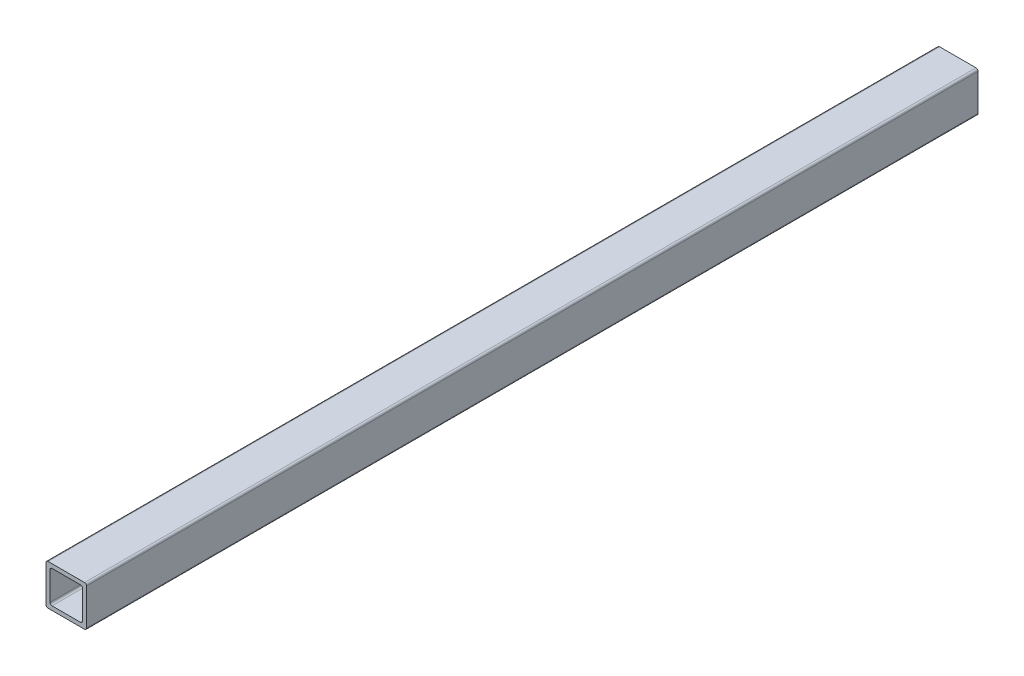
ISO-10303-21;
HEADER;
FILE_DESCRIPTION(('STEP AP214'),'2;1');
FILE_NAME('part.step','',(''),(''),'','','');
FILE_SCHEMA(('AUTOMOTIVE_DESIGN { 1 0 10303 214 1 1 1 1 }'));
ENDSEC;
DATA;
#1=APPLICATION_CONTEXT('core data for automotive mechanical design processes');
#2=APPLICATION_PROTOCOL_DEFINITION('international standard','automotive_design',2000,#1);
#3=PRODUCT_CONTEXT('',#1,'mechanical');
#4=PRODUCT('Part','Part','',(#3));
#5=PRODUCT_RELATED_PRODUCT_CATEGORY('part','',(#4));
#6=PRODUCT_DEFINITION_FORMATION('','',#4);
#7=PRODUCT_DEFINITION_CONTEXT('part definition',#1,'design');
#8=PRODUCT_DEFINITION('design','',#6,#7);
#9=PRODUCT_DEFINITION_SHAPE('','',#8);
#10=(LENGTH_UNIT() NAMED_UNIT(*) SI_UNIT(.MILLI.,.METRE.));
#11=(NAMED_UNIT(*) PLANE_ANGLE_UNIT() SI_UNIT($,.RADIAN.));
#12=(NAMED_UNIT(*) SI_UNIT($,.STERADIAN.) SOLID_ANGLE_UNIT());
#13=UNCERTAINTY_MEASURE_WITH_UNIT(LENGTH_MEASURE(1.E-05),#10,'distance_accuracy_value','');
#14=(GEOMETRIC_REPRESENTATION_CONTEXT(3) GLOBAL_UNCERTAINTY_ASSIGNED_CONTEXT((#13)) GLOBAL_UNIT_ASSIGNED_CONTEXT((#10,
#11,#12)) REPRESENTATION_CONTEXT('',''));
#15=CARTESIAN_POINT('',(0.,0.,0.));
#16=DIRECTION('',(0.,0.,1.));
#17=DIRECTION('',(1.,0.,0.));
#18=AXIS2_PLACEMENT_3D('',#15,#16,#17);
#19=CARTESIAN_POINT('',(2.,2.,880.));
#20=DIRECTION('',(0.,0.,-1.));
#21=DIRECTION('',(-1.,0.,0.));
#22=AXIS2_PLACEMENT_3D('',#19,#20,#21);
#23=PLANE('',#22);
#24=CARTESIAN_POINT('',(2.,2.,880.));
#25=DIRECTION('',(0.,0.,1.));
#26=DIRECTION('',(-1.,0.,0.));
#27=AXIS2_PLACEMENT_3D('',#24,#25,#26);
#28=CIRCLE('',#27,2.);
#29=CARTESIAN_POINT('',(0.,2.00000000000001,880.));
#30=VERTEX_POINT('',#29);
#31=CARTESIAN_POINT('',(2.00000000000001,0.,880.));
#32=VERTEX_POINT('',#31);
#33=EDGE_CURVE('E210',#30,#32,#28,.T.);
#34=ORIENTED_EDGE('',*,*,#33,.T.);
#35=DIRECTION('',(1.,0.,0.));
#36=VECTOR('',#35,1.);
#37=CARTESIAN_POINT('',(2.00000000000001,0.,880.));
#38=LINE('',#37,#36);
#39=CARTESIAN_POINT('',(38.,0.,880.));
#40=VERTEX_POINT('',#39);
#41=EDGE_CURVE('E213',#32,#40,#38,.T.);
#42=ORIENTED_EDGE('',*,*,#41,.T.);
#43=CARTESIAN_POINT('',(38.,2.,880.));
#44=DIRECTION('',(0.,0.,1.));
#45=DIRECTION('',(-1.,0.,0.));
#46=AXIS2_PLACEMENT_3D('',#43,#44,#45);
#47=CIRCLE('',#46,2.);
#48=CARTESIAN_POINT('',(40.,2.00000000000001,880.));
#49=VERTEX_POINT('',#48);
#50=EDGE_CURVE('E216',#40,#49,#47,.T.);
#51=ORIENTED_EDGE('',*,*,#50,.T.);
#52=DIRECTION('',(0.,1.,0.));
#53=VECTOR('',#52,1.);
#54=CARTESIAN_POINT('',(40.,2.00000000000001,880.));
#55=LINE('',#54,#53);
#56=CARTESIAN_POINT('',(40.,38.,880.));
#57=VERTEX_POINT('',#56);
#58=EDGE_CURVE('E218',#49,#57,#55,.T.);
#59=ORIENTED_EDGE('',*,*,#58,.T.);
#60=CARTESIAN_POINT('',(38.,38.,880.));
#61=DIRECTION('',(0.,0.,1.));
#62=DIRECTION('',(-1.,0.,0.));
#63=AXIS2_PLACEMENT_3D('',#60,#61,#62);
#64=CIRCLE('',#63,2.);
#65=CARTESIAN_POINT('',(38.,40.,880.));
#66=VERTEX_POINT('',#65);
#67=EDGE_CURVE('E220',#57,#66,#64,.T.);
#68=ORIENTED_EDGE('',*,*,#67,.T.);
#69=DIRECTION('',(-1.,0.,0.));
#70=VECTOR('',#69,1.);
#71=CARTESIAN_POINT('',(2.00000000000001,40.,880.));
#72=LINE('',#71,#70);
#73=CARTESIAN_POINT('',(2.00000000000001,40.,880.));
#74=VERTEX_POINT('',#73);
#75=EDGE_CURVE('E222',#66,#74,#72,.T.);
#76=ORIENTED_EDGE('',*,*,#75,.T.);
#77=CARTESIAN_POINT('',(2.,38.,880.));
#78=DIRECTION('',(0.,0.,1.));
#79=DIRECTION('',(-1.,0.,0.));
#80=AXIS2_PLACEMENT_3D('',#77,#78,#79);
#81=CIRCLE('',#80,2.);
#82=CARTESIAN_POINT('',(0.,38.,880.));
#83=VERTEX_POINT('',#82);
#84=EDGE_CURVE('E224',#74,#83,#81,.T.);
#85=ORIENTED_EDGE('',*,*,#84,.T.);
#86=DIRECTION('',(0.,-1.,0.));
#87=VECTOR('',#86,1.);
#88=CARTESIAN_POINT('',(0.,2.00000000000001,880.));
#89=LINE('',#88,#87);
#90=EDGE_CURVE('E226',#83,#30,#89,.T.);
#91=ORIENTED_EDGE('',*,*,#90,.T.);
#92=EDGE_LOOP('',(#34,#42,#51,#59,#68,#76,#85,#91));
#93=FACE_BOUND('',#92,.T.);
#94=CARTESIAN_POINT('',(34.,6.,880.));
#95=DIRECTION('',(0.,0.,1.));
#96=DIRECTION('',(1.,0.,0.));
#97=AXIS2_PLACEMENT_3D('',#94,#95,#96);
#98=CIRCLE('',#97,2.);
#99=CARTESIAN_POINT('',(34.,4.,880.));
#100=VERTEX_POINT('',#99);
#101=CARTESIAN_POINT('',(36.,6.00000000000001,880.));
#102=VERTEX_POINT('',#101);
#103=EDGE_CURVE('E145',#100,#102,#98,.T.);
#104=ORIENTED_EDGE('',*,*,#103,.F.);
#105=DIRECTION('',(1.,0.,0.));
#106=VECTOR('',#105,1.);
#107=CARTESIAN_POINT('',(6.00000000000001,4.,880.));
#108=LINE('',#107,#106);
#109=CARTESIAN_POINT('',(6.00000000000001,4.,880.));
#110=VERTEX_POINT('',#109);
#111=EDGE_CURVE('E178',#110,#100,#108,.T.);
#112=ORIENTED_EDGE('',*,*,#111,.F.);
#113=CARTESIAN_POINT('',(6.,6.,880.));
#114=DIRECTION('',(0.,0.,1.));
#115=DIRECTION('',(1.,0.,0.));
#116=AXIS2_PLACEMENT_3D('',#113,#114,#115);
#117=CIRCLE('',#116,2.);
#118=CARTESIAN_POINT('',(4.,6.00000000000001,880.));
#119=VERTEX_POINT('',#118);
#120=EDGE_CURVE('E176',#119,#110,#117,.T.);
#121=ORIENTED_EDGE('',*,*,#120,.F.);
#122=DIRECTION('',(0.,-1.,0.));
#123=VECTOR('',#122,1.);
#124=CARTESIAN_POINT('',(4.,6.00000000000001,880.));
#125=LINE('',#124,#123);
#126=CARTESIAN_POINT('',(4.,34.,880.));
#127=VERTEX_POINT('',#126);
#128=EDGE_CURVE('E174',#127,#119,#125,.T.);
#129=ORIENTED_EDGE('',*,*,#128,.F.);
#130=CARTESIAN_POINT('',(6.,34.,880.));
#131=DIRECTION('',(0.,0.,1.));
#132=DIRECTION('',(1.,0.,0.));
#133=AXIS2_PLACEMENT_3D('',#130,#131,#132);
#134=CIRCLE('',#133,2.);
#135=CARTESIAN_POINT('',(6.00000000000001,36.,880.));
#136=VERTEX_POINT('',#135);
#137=EDGE_CURVE('E172',#136,#127,#134,.T.);
#138=ORIENTED_EDGE('',*,*,#137,.F.);
#139=DIRECTION('',(-1.,0.,0.));
#140=VECTOR('',#139,1.);
#141=CARTESIAN_POINT('',(6.00000000000001,36.,880.));
#142=LINE('',#141,#140);
#143=CARTESIAN_POINT('',(34.,36.,880.));
#144=VERTEX_POINT('',#143);
#145=EDGE_CURVE('E168',#144,#136,#142,.T.);
#146=ORIENTED_EDGE('',*,*,#145,.F.);
#147=CARTESIAN_POINT('',(34.,34.,880.));
#148=DIRECTION('',(0.,0.,1.));
#149=DIRECTION('',(1.,0.,0.));
#150=AXIS2_PLACEMENT_3D('',#147,#148,#149);
#151=CIRCLE('',#150,2.);
#152=CARTESIAN_POINT('',(36.,34.,880.));
#153=VERTEX_POINT('',#152);
#154=EDGE_CURVE('E166',#153,#144,#151,.T.);
#155=ORIENTED_EDGE('',*,*,#154,.F.);
#156=DIRECTION('',(0.,1.,0.));
#157=VECTOR('',#156,1.);
#158=CARTESIAN_POINT('',(36.,6.00000000000001,880.));
#159=LINE('',#158,#157);
#160=EDGE_CURVE('E153',#102,#153,#159,.T.);
#161=ORIENTED_EDGE('',*,*,#160,.F.);
#162=EDGE_LOOP('',(#104,#112,#121,#129,#138,#146,#155,#161));
#163=FACE_BOUND('',#162,.T.);
#164=ADVANCED_FACE('F32',(#93,#163),#23,.F.);
#165=CARTESIAN_POINT('',(2.,2.,0.));
#166=DIRECTION('',(0.,0.,-1.));
#167=DIRECTION('',(-1.,0.,0.));
#168=AXIS2_PLACEMENT_3D('',#165,#166,#167);
#169=PLANE('',#168);
#170=CARTESIAN_POINT('',(2.,2.,0.));
#171=DIRECTION('',(0.,0.,1.));
#172=DIRECTION('',(-1.,0.,0.));
#173=AXIS2_PLACEMENT_3D('',#170,#171,#172);
#174=CIRCLE('',#173,2.);
#175=CARTESIAN_POINT('',(0.,2.00000000000001,0.));
#176=VERTEX_POINT('',#175);
#177=CARTESIAN_POINT('',(2.00000000000001,0.,0.));
#178=VERTEX_POINT('',#177);
#179=EDGE_CURVE('E161',#176,#178,#174,.T.);
#180=ORIENTED_EDGE('',*,*,#179,.F.);
#181=DIRECTION('',(0.,-1.,0.));
#182=VECTOR('',#181,1.);
#183=CARTESIAN_POINT('',(0.,2.00000000000001,0.));
#184=LINE('',#183,#182);
#185=CARTESIAN_POINT('',(0.,38.,0.));
#186=VERTEX_POINT('',#185);
#187=EDGE_CURVE('E214',#186,#176,#184,.T.);
#188=ORIENTED_EDGE('',*,*,#187,.F.);
#189=CARTESIAN_POINT('',(2.,38.,0.));
#190=DIRECTION('',(0.,0.,1.));
#191=DIRECTION('',(-1.,0.,0.));
#192=AXIS2_PLACEMENT_3D('',#189,#190,#191);
#193=CIRCLE('',#192,2.);
#194=CARTESIAN_POINT('',(2.00000000000001,40.,0.));
#195=VERTEX_POINT('',#194);
#196=EDGE_CURVE('E241',#195,#186,#193,.T.);
#197=ORIENTED_EDGE('',*,*,#196,.F.);
#198=DIRECTION('',(-1.,0.,0.));
#199=VECTOR('',#198,1.);
#200=CARTESIAN_POINT('',(2.00000000000001,40.,0.));
#201=LINE('',#200,#199);
#202=CARTESIAN_POINT('',(38.,40.,0.));
#203=VERTEX_POINT('',#202);
#204=EDGE_CURVE('E239',#203,#195,#201,.T.);
#205=ORIENTED_EDGE('',*,*,#204,.F.);
#206=CARTESIAN_POINT('',(38.,38.,0.));
#207=DIRECTION('',(0.,0.,1.));
#208=DIRECTION('',(-1.,0.,0.));
#209=AXIS2_PLACEMENT_3D('',#206,#207,#208);
#210=CIRCLE('',#209,2.);
#211=CARTESIAN_POINT('',(40.,38.,0.));
#212=VERTEX_POINT('',#211);
#213=EDGE_CURVE('E237',#212,#203,#210,.T.);
#214=ORIENTED_EDGE('',*,*,#213,.F.);
#215=DIRECTION('',(0.,1.,0.));
#216=VECTOR('',#215,1.);
#217=CARTESIAN_POINT('',(40.,2.00000000000001,0.));
#218=LINE('',#217,#216);
#219=CARTESIAN_POINT('',(40.,2.00000000000001,0.));
#220=VERTEX_POINT('',#219);
#221=EDGE_CURVE('E235',#220,#212,#218,.T.);
#222=ORIENTED_EDGE('',*,*,#221,.F.);
#223=CARTESIAN_POINT('',(38.,2.,0.));
#224=DIRECTION('',(0.,0.,1.));
#225=DIRECTION('',(-1.,0.,0.));
#226=AXIS2_PLACEMENT_3D('',#223,#224,#225);
#227=CIRCLE('',#226,2.);
#228=CARTESIAN_POINT('',(38.,0.,0.));
#229=VERTEX_POINT('',#228);
#230=EDGE_CURVE('E233',#229,#220,#227,.T.);
#231=ORIENTED_EDGE('',*,*,#230,.F.);
#232=DIRECTION('',(1.,0.,0.));
#233=VECTOR('',#232,1.);
#234=CARTESIAN_POINT('',(2.00000000000001,0.,0.));
#235=LINE('',#234,#233);
#236=EDGE_CURVE('E231',#178,#229,#235,.T.);
#237=ORIENTED_EDGE('',*,*,#236,.F.);
#238=EDGE_LOOP('',(#180,#188,#197,#205,#214,#222,#231,#237));
#239=FACE_BOUND('',#238,.T.);
#240=DIRECTION('',(1.,0.,0.));
#241=VECTOR('',#240,1.);
#242=CARTESIAN_POINT('',(6.00000000000001,4.,0.));
#243=LINE('',#242,#241);
#244=CARTESIAN_POINT('',(6.00000000000001,4.,0.));
#245=VERTEX_POINT('',#244);
#246=CARTESIAN_POINT('',(34.,4.,0.));
#247=VERTEX_POINT('',#246);
#248=EDGE_CURVE('E154',#245,#247,#243,.T.);
#249=ORIENTED_EDGE('',*,*,#248,.T.);
#250=CARTESIAN_POINT('',(34.,6.,0.));
#251=DIRECTION('',(0.,0.,1.));
#252=DIRECTION('',(1.,0.,0.));
#253=AXIS2_PLACEMENT_3D('',#250,#251,#252);
#254=CIRCLE('',#253,2.);
#255=CARTESIAN_POINT('',(36.,6.00000000000001,0.));
#256=VERTEX_POINT('',#255);
#257=EDGE_CURVE('E55',#247,#256,#254,.T.);
#258=ORIENTED_EDGE('',*,*,#257,.T.);
#259=DIRECTION('',(0.,1.,0.));
#260=VECTOR('',#259,1.);
#261=CARTESIAN_POINT('',(36.,6.00000000000001,0.));
#262=LINE('',#261,#260);
#263=CARTESIAN_POINT('',(36.,34.,0.));
#264=VERTEX_POINT('',#263);
#265=EDGE_CURVE('E160',#256,#264,#262,.T.);
#266=ORIENTED_EDGE('',*,*,#265,.T.);
#267=CARTESIAN_POINT('',(34.,34.,0.));
#268=DIRECTION('',(0.,0.,1.));
#269=DIRECTION('',(1.,0.,0.));
#270=AXIS2_PLACEMENT_3D('',#267,#268,#269);
#271=CIRCLE('',#270,2.);
#272=CARTESIAN_POINT('',(34.,36.,0.));
#273=VERTEX_POINT('',#272);
#274=EDGE_CURVE('E182',#264,#273,#271,.T.);
#275=ORIENTED_EDGE('',*,*,#274,.T.);
#276=DIRECTION('',(-1.,0.,0.));
#277=VECTOR('',#276,1.);
#278=CARTESIAN_POINT('',(6.00000000000001,36.,0.));
#279=LINE('',#278,#277);
#280=CARTESIAN_POINT('',(6.00000000000001,36.,0.));
#281=VERTEX_POINT('',#280);
#282=EDGE_CURVE('E185',#273,#281,#279,.T.);
#283=ORIENTED_EDGE('',*,*,#282,.T.);
#284=CARTESIAN_POINT('',(6.,34.,0.));
#285=DIRECTION('',(0.,0.,1.));
#286=DIRECTION('',(1.,0.,0.));
#287=AXIS2_PLACEMENT_3D('',#284,#285,#286);
#288=CIRCLE('',#287,2.);
#289=CARTESIAN_POINT('',(4.,34.,0.));
#290=VERTEX_POINT('',#289);
#291=EDGE_CURVE('E188',#281,#290,#288,.T.);
#292=ORIENTED_EDGE('',*,*,#291,.T.);
#293=DIRECTION('',(0.,-1.,0.));
#294=VECTOR('',#293,1.);
#295=CARTESIAN_POINT('',(4.,6.00000000000001,0.));
#296=LINE('',#295,#294);
#297=CARTESIAN_POINT('',(4.,6.00000000000001,0.));
#298=VERTEX_POINT('',#297);
#299=EDGE_CURVE('E191',#290,#298,#296,.T.);
#300=ORIENTED_EDGE('',*,*,#299,.T.);
#301=CARTESIAN_POINT('',(6.,6.,0.));
#302=DIRECTION('',(0.,0.,1.));
#303=DIRECTION('',(1.,0.,0.));
#304=AXIS2_PLACEMENT_3D('',#301,#302,#303);
#305=CIRCLE('',#304,2.);
#306=EDGE_CURVE('E194',#298,#245,#305,.T.);
#307=ORIENTED_EDGE('',*,*,#306,.T.);
#308=EDGE_LOOP('',(#249,#258,#266,#275,#283,#292,#300,#307));
#309=FACE_BOUND('',#308,.T.);
#310=ADVANCED_FACE('F271',(#239,#309),#169,.T.);
#311=CARTESIAN_POINT('',(2.,2.,880.));
#312=DIRECTION('',(0.,0.,-1.));
#313=DIRECTION('',(-1.,0.,0.));
#314=AXIS2_PLACEMENT_3D('',#311,#312,#313);
#315=CYLINDRICAL_SURFACE('',#314,2.);
#316=ORIENTED_EDGE('',*,*,#179,.T.);
#317=DIRECTION('',(0.,0.,-1.));
#318=VECTOR('',#317,1.);
#319=CARTESIAN_POINT('',(2.00000000000001,0.,880.));
#320=LINE('',#319,#318);
#321=EDGE_CURVE('E11',#32,#178,#320,.T.);
#322=ORIENTED_EDGE('',*,*,#321,.F.);
#323=ORIENTED_EDGE('',*,*,#33,.F.);
#324=DIRECTION('',(0.,0.,-1.));
#325=VECTOR('',#324,1.);
#326=CARTESIAN_POINT('',(0.,2.00000000000001,880.));
#327=LINE('',#326,#325);
#328=EDGE_CURVE('E228',#30,#176,#327,.T.);
#329=ORIENTED_EDGE('',*,*,#328,.T.);
#330=EDGE_LOOP('',(#316,#322,#323,#329));
#331=FACE_BOUND('',#330,.T.);
#332=ADVANCED_FACE('F34',(#331),#315,.T.);
#333=CARTESIAN_POINT('',(2.00000000000001,0.,880.));
#334=DIRECTION('',(0.,1.,0.));
#335=DIRECTION('',(0.,0.,1.));
#336=AXIS2_PLACEMENT_3D('',#333,#334,#335);
#337=PLANE('',#336);
#338=ORIENTED_EDGE('',*,*,#236,.T.);
#339=DIRECTION('',(0.,0.,-1.));
#340=VECTOR('',#339,1.);
#341=CARTESIAN_POINT('',(38.,0.,880.));
#342=LINE('',#341,#340);
#343=EDGE_CURVE('E40',#40,#229,#342,.T.);
#344=ORIENTED_EDGE('',*,*,#343,.F.);
#345=ORIENTED_EDGE('',*,*,#41,.F.);
#346=ORIENTED_EDGE('',*,*,#321,.T.);
#347=EDGE_LOOP('',(#338,#344,#345,#346));
#348=FACE_BOUND('',#347,.T.);
#349=ADVANCED_FACE('F288',(#348),#337,.F.);
#350=CARTESIAN_POINT('',(38.,2.,880.));
#351=DIRECTION('',(0.,0.,-1.));
#352=DIRECTION('',(-1.,0.,0.));
#353=AXIS2_PLACEMENT_3D('',#350,#351,#352);
#354=CYLINDRICAL_SURFACE('',#353,2.);
#355=ORIENTED_EDGE('',*,*,#230,.T.);
#356=DIRECTION('',(0.,0.,-1.));
#357=VECTOR('',#356,1.);
#358=CARTESIAN_POINT('',(40.,2.00000000000001,880.));
#359=LINE('',#358,#357);
#360=EDGE_CURVE('E258',#49,#220,#359,.T.);
#361=ORIENTED_EDGE('',*,*,#360,.F.);
#362=ORIENTED_EDGE('',*,*,#50,.F.);
#363=ORIENTED_EDGE('',*,*,#343,.T.);
#364=EDGE_LOOP('',(#355,#361,#362,#363));
#365=FACE_BOUND('',#364,.T.);
#366=ADVANCED_FACE('F265',(#365),#354,.T.);
#367=CARTESIAN_POINT('',(40.,2.00000000000001,880.));
#368=DIRECTION('',(-1.,0.,0.));
#369=DIRECTION('',(0.,0.,1.));
#370=AXIS2_PLACEMENT_3D('',#367,#368,#369);
#371=PLANE('',#370);
#372=ORIENTED_EDGE('',*,*,#221,.T.);
#373=DIRECTION('',(0.,0.,-1.));
#374=VECTOR('',#373,1.);
#375=CARTESIAN_POINT('',(40.,38.,880.));
#376=LINE('',#375,#374);
#377=EDGE_CURVE('E255',#57,#212,#376,.T.);
#378=ORIENTED_EDGE('',*,*,#377,.F.);
#379=ORIENTED_EDGE('',*,*,#58,.F.);
#380=ORIENTED_EDGE('',*,*,#360,.T.);
#381=EDGE_LOOP('',(#372,#378,#379,#380));
#382=FACE_BOUND('',#381,.T.);
#383=ADVANCED_FACE('F277',(#382),#371,.F.);
#384=CARTESIAN_POINT('',(38.,38.,880.));
#385=DIRECTION('',(0.,0.,-1.));
#386=DIRECTION('',(-1.,0.,0.));
#387=AXIS2_PLACEMENT_3D('',#384,#385,#386);
#388=CYLINDRICAL_SURFACE('',#387,2.);
#389=ORIENTED_EDGE('',*,*,#213,.T.);
#390=DIRECTION('',(0.,0.,-1.));
#391=VECTOR('',#390,1.);
#392=CARTESIAN_POINT('',(38.,40.,880.));
#393=LINE('',#392,#391);
#394=EDGE_CURVE('E252',#66,#203,#393,.T.);
#395=ORIENTED_EDGE('',*,*,#394,.F.);
#396=ORIENTED_EDGE('',*,*,#67,.F.);
#397=ORIENTED_EDGE('',*,*,#377,.T.);
#398=EDGE_LOOP('',(#389,#395,#396,#397));
#399=FACE_BOUND('',#398,.T.);
#400=ADVANCED_FACE('F281',(#399),#388,.T.);
#401=CARTESIAN_POINT('',(2.00000000000001,40.,880.));
#402=DIRECTION('',(0.,-1.,0.));
#403=DIRECTION('',(0.,0.,-1.));
#404=AXIS2_PLACEMENT_3D('',#401,#402,#403);
#405=PLANE('',#404);
#406=ORIENTED_EDGE('',*,*,#204,.T.);
#407=DIRECTION('',(0.,0.,-1.));
#408=VECTOR('',#407,1.);
#409=CARTESIAN_POINT('',(2.00000000000001,40.,880.));
#410=LINE('',#409,#408);
#411=EDGE_CURVE('E249',#74,#195,#410,.T.);
#412=ORIENTED_EDGE('',*,*,#411,.F.);
#413=ORIENTED_EDGE('',*,*,#75,.F.);
#414=ORIENTED_EDGE('',*,*,#394,.T.);
#415=EDGE_LOOP('',(#406,#412,#413,#414));
#416=FACE_BOUND('',#415,.T.);
#417=ADVANCED_FACE('F301',(#416),#405,.F.);
#418=CARTESIAN_POINT('',(2.,38.,880.));
#419=DIRECTION('',(0.,0.,-1.));
#420=DIRECTION('',(-1.,0.,0.));
#421=AXIS2_PLACEMENT_3D('',#418,#419,#420);
#422=CYLINDRICAL_SURFACE('',#421,2.);
#423=ORIENTED_EDGE('',*,*,#196,.T.);
#424=DIRECTION('',(0.,0.,-1.));
#425=VECTOR('',#424,1.);
#426=CARTESIAN_POINT('',(0.,38.,880.));
#427=LINE('',#426,#425);
#428=EDGE_CURVE('E246',#83,#186,#427,.T.);
#429=ORIENTED_EDGE('',*,*,#428,.F.);
#430=ORIENTED_EDGE('',*,*,#84,.F.);
#431=ORIENTED_EDGE('',*,*,#411,.T.);
#432=EDGE_LOOP('',(#423,#429,#430,#431));
#433=FACE_BOUND('',#432,.T.);
#434=ADVANCED_FACE('F299',(#433),#422,.T.);
#435=CARTESIAN_POINT('',(0.,2.00000000000001,880.));
#436=DIRECTION('',(1.,0.,0.));
#437=DIRECTION('',(0.,0.,-1.));
#438=AXIS2_PLACEMENT_3D('',#435,#436,#437);
#439=PLANE('',#438);
#440=ORIENTED_EDGE('',*,*,#187,.T.);
#441=ORIENTED_EDGE('',*,*,#328,.F.);
#442=ORIENTED_EDGE('',*,*,#90,.F.);
#443=ORIENTED_EDGE('',*,*,#428,.T.);
#444=EDGE_LOOP('',(#440,#441,#442,#443));
#445=FACE_BOUND('',#444,.T.);
#446=ADVANCED_FACE('F294',(#445),#439,.F.);
#447=CARTESIAN_POINT('',(34.,6.,880.));
#448=DIRECTION('',(0.,0.,-1.));
#449=DIRECTION('',(-1.,0.,0.));
#450=AXIS2_PLACEMENT_3D('',#447,#448,#449);
#451=CYLINDRICAL_SURFACE('',#450,2.);
#452=ORIENTED_EDGE('',*,*,#257,.F.);
#453=DIRECTION('',(0.,0.,-1.));
#454=VECTOR('',#453,1.);
#455=CARTESIAN_POINT('',(34.,4.,880.));
#456=LINE('',#455,#454);
#457=EDGE_CURVE('E149',#100,#247,#456,.T.);
#458=ORIENTED_EDGE('',*,*,#457,.F.);
#459=ORIENTED_EDGE('',*,*,#103,.T.);
#460=DIRECTION('',(0.,0.,-1.));
#461=VECTOR('',#460,1.);
#462=CARTESIAN_POINT('',(36.,6.00000000000001,880.));
#463=LINE('',#462,#461);
#464=EDGE_CURVE('E148',#102,#256,#463,.T.);
#465=ORIENTED_EDGE('',*,*,#464,.T.);
#466=EDGE_LOOP('',(#452,#458,#459,#465));
#467=FACE_BOUND('',#466,.T.);
#468=ADVANCED_FACE('F147',(#467),#451,.F.);
#469=CARTESIAN_POINT('',(36.,6.00000000000001,880.));
#470=DIRECTION('',(-1.,0.,0.));
#471=DIRECTION('',(0.,0.,1.));
#472=AXIS2_PLACEMENT_3D('',#469,#470,#471);
#473=PLANE('',#472);
#474=ORIENTED_EDGE('',*,*,#265,.F.);
#475=ORIENTED_EDGE('',*,*,#464,.F.);
#476=ORIENTED_EDGE('',*,*,#160,.T.);
#477=DIRECTION('',(0.,0.,-1.));
#478=VECTOR('',#477,1.);
#479=CARTESIAN_POINT('',(36.,34.,880.));
#480=LINE('',#479,#478);
#481=EDGE_CURVE('E162',#153,#264,#480,.T.);
#482=ORIENTED_EDGE('',*,*,#481,.T.);
#483=EDGE_LOOP('',(#474,#475,#476,#482));
#484=FACE_BOUND('',#483,.T.);
#485=ADVANCED_FACE('F157',(#484),#473,.T.);
#486=CARTESIAN_POINT('',(34.,34.,880.));
#487=DIRECTION('',(0.,0.,-1.));
#488=DIRECTION('',(-1.,0.,0.));
#489=AXIS2_PLACEMENT_3D('',#486,#487,#488);
#490=CYLINDRICAL_SURFACE('',#489,2.);
#491=ORIENTED_EDGE('',*,*,#274,.F.);
#492=ORIENTED_EDGE('',*,*,#481,.F.);
#493=ORIENTED_EDGE('',*,*,#154,.T.);
#494=DIRECTION('',(0.,0.,-1.));
#495=VECTOR('',#494,1.);
#496=CARTESIAN_POINT('',(34.,36.,880.));
#497=LINE('',#496,#495);
#498=EDGE_CURVE('E207',#144,#273,#497,.T.);
#499=ORIENTED_EDGE('',*,*,#498,.T.);
#500=EDGE_LOOP('',(#491,#492,#493,#499));
#501=FACE_BOUND('',#500,.T.);
#502=ADVANCED_FACE('F326',(#501),#490,.F.);
#503=CARTESIAN_POINT('',(6.00000000000001,36.,880.));
#504=DIRECTION('',(0.,-1.,0.));
#505=DIRECTION('',(0.,0.,-1.));
#506=AXIS2_PLACEMENT_3D('',#503,#504,#505);
#507=PLANE('',#506);
#508=ORIENTED_EDGE('',*,*,#282,.F.);
#509=ORIENTED_EDGE('',*,*,#498,.F.);
#510=ORIENTED_EDGE('',*,*,#145,.T.);
#511=DIRECTION('',(0.,0.,-1.));
#512=VECTOR('',#511,1.);
#513=CARTESIAN_POINT('',(6.00000000000001,36.,880.));
#514=LINE('',#513,#512);
#515=EDGE_CURVE('E205',#136,#281,#514,.T.);
#516=ORIENTED_EDGE('',*,*,#515,.T.);
#517=EDGE_LOOP('',(#508,#509,#510,#516));
#518=FACE_BOUND('',#517,.T.);
#519=ADVANCED_FACE('F330',(#518),#507,.T.);
#520=CARTESIAN_POINT('',(6.,34.,880.));
#521=DIRECTION('',(0.,0.,-1.));
#522=DIRECTION('',(-1.,0.,0.));
#523=AXIS2_PLACEMENT_3D('',#520,#521,#522);
#524=CYLINDRICAL_SURFACE('',#523,2.);
#525=ORIENTED_EDGE('',*,*,#291,.F.);
#526=ORIENTED_EDGE('',*,*,#515,.F.);
#527=ORIENTED_EDGE('',*,*,#137,.T.);
#528=DIRECTION('',(0.,0.,-1.));
#529=VECTOR('',#528,1.);
#530=CARTESIAN_POINT('',(4.,34.,880.));
#531=LINE('',#530,#529);
#532=EDGE_CURVE('E203',#127,#290,#531,.T.);
#533=ORIENTED_EDGE('',*,*,#532,.T.);
#534=EDGE_LOOP('',(#525,#526,#527,#533));
#535=FACE_BOUND('',#534,.T.);
#536=ADVANCED_FACE('F336',(#535),#524,.F.);
#537=CARTESIAN_POINT('',(4.,6.00000000000001,880.));
#538=DIRECTION('',(1.,0.,0.));
#539=DIRECTION('',(0.,0.,-1.));
#540=AXIS2_PLACEMENT_3D('',#537,#538,#539);
#541=PLANE('',#540);
#542=ORIENTED_EDGE('',*,*,#299,.F.);
#543=ORIENTED_EDGE('',*,*,#532,.F.);
#544=ORIENTED_EDGE('',*,*,#128,.T.);
#545=DIRECTION('',(0.,0.,-1.));
#546=VECTOR('',#545,1.);
#547=CARTESIAN_POINT('',(4.,6.00000000000001,880.));
#548=LINE('',#547,#546);
#549=EDGE_CURVE('E201',#119,#298,#548,.T.);
#550=ORIENTED_EDGE('',*,*,#549,.T.);
#551=EDGE_LOOP('',(#542,#543,#544,#550));
#552=FACE_BOUND('',#551,.T.);
#553=ADVANCED_FACE('F340',(#552),#541,.T.);
#554=CARTESIAN_POINT('',(6.,6.,880.));
#555=DIRECTION('',(0.,0.,-1.));
#556=DIRECTION('',(-1.,0.,0.));
#557=AXIS2_PLACEMENT_3D('',#554,#555,#556);
#558=CYLINDRICAL_SURFACE('',#557,2.);
#559=ORIENTED_EDGE('',*,*,#306,.F.);
#560=ORIENTED_EDGE('',*,*,#549,.F.);
#561=ORIENTED_EDGE('',*,*,#120,.T.);
#562=DIRECTION('',(0.,0.,-1.));
#563=VECTOR('',#562,1.);
#564=CARTESIAN_POINT('',(6.00000000000001,4.,880.));
#565=LINE('',#564,#563);
#566=EDGE_CURVE('E47',#110,#245,#565,.T.);
#567=ORIENTED_EDGE('',*,*,#566,.T.);
#568=EDGE_LOOP('',(#559,#560,#561,#567));
#569=FACE_BOUND('',#568,.T.);
#570=ADVANCED_FACE('F344',(#569),#558,.F.);
#571=CARTESIAN_POINT('',(6.00000000000001,4.,880.));
#572=DIRECTION('',(0.,1.,0.));
#573=DIRECTION('',(0.,0.,1.));
#574=AXIS2_PLACEMENT_3D('',#571,#572,#573);
#575=PLANE('',#574);
#576=ORIENTED_EDGE('',*,*,#248,.F.);
#577=ORIENTED_EDGE('',*,*,#566,.F.);
#578=ORIENTED_EDGE('',*,*,#111,.T.);
#579=ORIENTED_EDGE('',*,*,#457,.T.);
#580=EDGE_LOOP('',(#576,#577,#578,#579));
#581=FACE_BOUND('',#580,.T.);
#582=ADVANCED_FACE('F348',(#581),#575,.T.);
#583=CLOSED_SHELL('',(#164,#310,#332,#349,#366,#383,#400,#417,#434,#446,#468,#485,#502,#519,
#536,#553,#570,#582));
#584=MANIFOLD_SOLID_BREP('B2',#583);
#585=ADVANCED_BREP_SHAPE_REPRESENTATION('',(#18,#584),#14);
#586=SHAPE_DEFINITION_REPRESENTATION(#9,#585);
ENDSEC;
END-ISO-10303-21;
